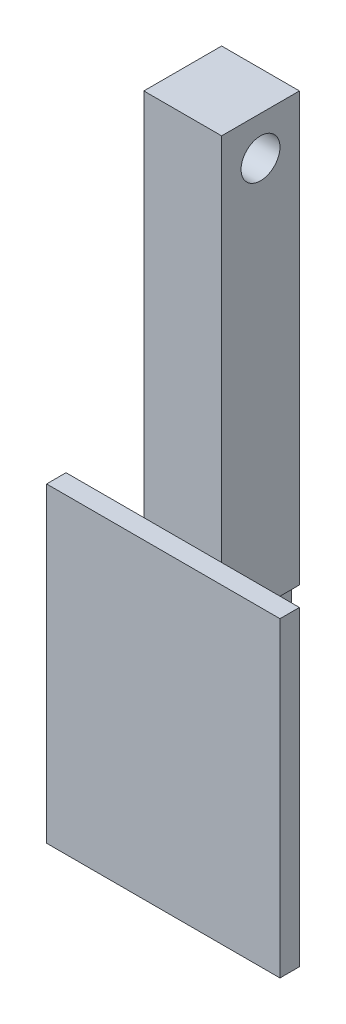
ISO-10303-21;
HEADER;
FILE_DESCRIPTION(('STEP AP214'),'2;1');
FILE_NAME('part.step','',(''),(''),'','','');
FILE_SCHEMA(('AUTOMOTIVE_DESIGN { 1 0 10303 214 1 1 1 1 }'));
ENDSEC;
DATA;
#1=APPLICATION_CONTEXT('core data for automotive mechanical design processes');
#2=APPLICATION_PROTOCOL_DEFINITION('international standard','automotive_design',2000,#1);
#3=PRODUCT_CONTEXT('',#1,'mechanical');
#4=PRODUCT('Part','Part','',(#3));
#5=PRODUCT_RELATED_PRODUCT_CATEGORY('part','',(#4));
#6=PRODUCT_DEFINITION_FORMATION('','',#4);
#7=PRODUCT_DEFINITION_CONTEXT('part definition',#1,'design');
#8=PRODUCT_DEFINITION('design','',#6,#7);
#9=PRODUCT_DEFINITION_SHAPE('','',#8);
#10=(LENGTH_UNIT() NAMED_UNIT(*) SI_UNIT(.MILLI.,.METRE.));
#11=(NAMED_UNIT(*) PLANE_ANGLE_UNIT() SI_UNIT($,.RADIAN.));
#12=(NAMED_UNIT(*) SI_UNIT($,.STERADIAN.) SOLID_ANGLE_UNIT());
#13=UNCERTAINTY_MEASURE_WITH_UNIT(LENGTH_MEASURE(1.E-05),#10,'distance_accuracy_value','');
#14=(GEOMETRIC_REPRESENTATION_CONTEXT(3) GLOBAL_UNCERTAINTY_ASSIGNED_CONTEXT((#13)) GLOBAL_UNIT_ASSIGNED_CONTEXT((#10,
#11,#12)) REPRESENTATION_CONTEXT('',''));
#15=CARTESIAN_POINT('',(0.,0.,0.));
#16=DIRECTION('',(0.,0.,1.));
#17=DIRECTION('',(1.,0.,0.));
#18=AXIS2_PLACEMENT_3D('',#15,#16,#17);
#19=CARTESIAN_POINT('',(-12.7,222.25,12.7));
#20=DIRECTION('',(0.,0.,-1.));
#21=DIRECTION('',(-1.,0.,0.));
#22=AXIS2_PLACEMENT_3D('',#19,#20,#21);
#23=PLANE('',#22);
#24=DIRECTION('',(-1.,0.,0.));
#25=VECTOR('',#24,1.);
#26=CARTESIAN_POINT('',(-38.1,101.6,12.7));
#27=LINE('',#26,#25);
#28=CARTESIAN_POINT('',(12.7,101.6,12.7));
#29=VERTEX_POINT('',#28);
#30=CARTESIAN_POINT('',(-12.7,101.6,12.7));
#31=VERTEX_POINT('',#30);
#32=EDGE_CURVE('E11',#29,#31,#27,.T.);
#33=ORIENTED_EDGE('',*,*,#32,.F.);
#34=DIRECTION('',(0.,-1.,0.));
#35=VECTOR('',#34,1.);
#36=CARTESIAN_POINT('',(12.7,222.25,12.7));
#37=LINE('',#36,#35);
#38=CARTESIAN_POINT('',(12.7,222.25,12.7));
#39=VERTEX_POINT('',#38);
#40=EDGE_CURVE('E223',#39,#29,#37,.T.);
#41=ORIENTED_EDGE('',*,*,#40,.F.);
#42=DIRECTION('',(1.,0.,0.));
#43=VECTOR('',#42,1.);
#44=CARTESIAN_POINT('',(-12.7,222.25,12.7));
#45=LINE('',#44,#43);
#46=CARTESIAN_POINT('',(-12.7,222.25,12.7));
#47=VERTEX_POINT('',#46);
#48=EDGE_CURVE('E218',#47,#39,#45,.T.);
#49=ORIENTED_EDGE('',*,*,#48,.F.);
#50=DIRECTION('',(0.,-1.,0.));
#51=VECTOR('',#50,1.);
#52=CARTESIAN_POINT('',(-12.7,222.25,12.7));
#53=LINE('',#52,#51);
#54=EDGE_CURVE('E226',#47,#31,#53,.T.);
#55=ORIENTED_EDGE('',*,*,#54,.T.);
#56=EDGE_LOOP('',(#33,#41,#49,#55));
#57=FACE_BOUND('',#56,.T.);
#58=ADVANCED_FACE('F39',(#57),#23,.F.);
#59=CARTESIAN_POINT('',(12.7,222.25,-12.7));
#60=DIRECTION('',(-1.,0.,0.));
#61=DIRECTION('',(0.,0.,1.));
#62=AXIS2_PLACEMENT_3D('',#59,#60,#61);
#63=PLANE('',#62);
#64=CARTESIAN_POINT('',(12.7,209.55,0.));
#65=DIRECTION('',(1.,0.,0.));
#66=DIRECTION('',(0.,0.,-1.));
#67=AXIS2_PLACEMENT_3D('',#64,#65,#66);
#68=CIRCLE('',#67,6.35);
#69=CARTESIAN_POINT('',(12.7,209.55,-6.35));
#70=VERTEX_POINT('',#69);
#71=EDGE_CURVE('E164',#70,#70,#68,.T.);
#72=ORIENTED_EDGE('',*,*,#71,.F.);
#73=EDGE_LOOP('',(#72));
#74=FACE_BOUND('',#73,.T.);
#75=ORIENTED_EDGE('',*,*,#40,.T.);
#76=CARTESIAN_POINT('',(12.7,82.55,12.7));
#77=VERTEX_POINT('',#76);
#78=EDGE_CURVE('E220',#29,#77,#37,.T.);
#79=ORIENTED_EDGE('',*,*,#78,.T.);
#80=DIRECTION('',(0.,0.,1.));
#81=VECTOR('',#80,1.);
#82=CARTESIAN_POINT('',(12.7,82.55,-209.55));
#83=LINE('',#82,#81);
#84=CARTESIAN_POINT('',(12.7,82.55,-12.7));
#85=VERTEX_POINT('',#84);
#86=EDGE_CURVE('E192',#85,#77,#83,.T.);
#87=ORIENTED_EDGE('',*,*,#86,.F.);
#88=DIRECTION('',(0.,-1.,0.));
#89=VECTOR('',#88,1.);
#90=CARTESIAN_POINT('',(12.7,222.25,-12.7));
#91=LINE('',#90,#89);
#92=CARTESIAN_POINT('',(12.7,222.25,-12.7));
#93=VERTEX_POINT('',#92);
#94=EDGE_CURVE('E231',#93,#85,#91,.T.);
#95=ORIENTED_EDGE('',*,*,#94,.F.);
#96=DIRECTION('',(0.,0.,-1.));
#97=VECTOR('',#96,1.);
#98=CARTESIAN_POINT('',(12.7,222.25,-12.7));
#99=LINE('',#98,#97);
#100=EDGE_CURVE('E211',#39,#93,#99,.T.);
#101=ORIENTED_EDGE('',*,*,#100,.F.);
#102=EDGE_LOOP('',(#75,#79,#87,#95,#101));
#103=FACE_BOUND('',#102,.T.);
#104=ADVANCED_FACE('F41',(#74,#103),#63,.F.);
#105=CARTESIAN_POINT('',(-12.7,222.25,-12.7));
#106=DIRECTION('',(0.,0.,1.));
#107=DIRECTION('',(1.,0.,0.));
#108=AXIS2_PLACEMENT_3D('',#105,#106,#107);
#109=PLANE('',#108);
#110=DIRECTION('',(0.,1.,0.));
#111=VECTOR('',#110,1.);
#112=CARTESIAN_POINT('',(-10.16,222.25,-12.7));
#113=LINE('',#112,#111);
#114=CARTESIAN_POINT('',(-10.16,0.,-12.7));
#115=VERTEX_POINT('',#114);
#116=CARTESIAN_POINT('',(-10.16,82.55,-12.7));
#117=VERTEX_POINT('',#116);
#118=EDGE_CURVE('E64',#115,#117,#113,.T.);
#119=ORIENTED_EDGE('',*,*,#118,.T.);
#120=DIRECTION('',(-1.,0.,0.));
#121=VECTOR('',#120,1.);
#122=CARTESIAN_POINT('',(-12.7,82.55,-12.7));
#123=LINE('',#122,#121);
#124=CARTESIAN_POINT('',(-12.7,82.55,-12.7));
#125=VERTEX_POINT('',#124);
#126=EDGE_CURVE('E207',#117,#125,#123,.T.);
#127=ORIENTED_EDGE('',*,*,#126,.T.);
#128=DIRECTION('',(0.,-1.,0.));
#129=VECTOR('',#128,1.);
#130=CARTESIAN_POINT('',(-12.7,222.25,-12.7));
#131=LINE('',#130,#129);
#132=CARTESIAN_POINT('',(-12.7,222.25,-12.7));
#133=VERTEX_POINT('',#132);
#134=EDGE_CURVE('E228',#133,#125,#131,.T.);
#135=ORIENTED_EDGE('',*,*,#134,.F.);
#136=DIRECTION('',(-1.,0.,0.));
#137=VECTOR('',#136,1.);
#138=CARTESIAN_POINT('',(-12.7,222.25,-12.7));
#139=LINE('',#138,#137);
#140=EDGE_CURVE('E214',#93,#133,#139,.T.);
#141=ORIENTED_EDGE('',*,*,#140,.F.);
#142=ORIENTED_EDGE('',*,*,#94,.T.);
#143=DIRECTION('',(-1.,0.,0.));
#144=VECTOR('',#143,1.);
#145=CARTESIAN_POINT('',(-12.7,82.55,-12.7));
#146=LINE('',#145,#144);
#147=CARTESIAN_POINT('',(10.16,82.55,-12.7));
#148=VERTEX_POINT('',#147);
#149=EDGE_CURVE('E204',#85,#148,#146,.T.);
#150=ORIENTED_EDGE('',*,*,#149,.T.);
#151=DIRECTION('',(0.,-1.,0.));
#152=VECTOR('',#151,1.);
#153=CARTESIAN_POINT('',(10.16,222.25,-12.7));
#154=LINE('',#153,#152);
#155=CARTESIAN_POINT('',(10.16,0.,-12.7));
#156=VERTEX_POINT('',#155);
#157=EDGE_CURVE('E190',#148,#156,#154,.T.);
#158=ORIENTED_EDGE('',*,*,#157,.T.);
#159=DIRECTION('',(-1.,0.,0.));
#160=VECTOR('',#159,1.);
#161=CARTESIAN_POINT('',(-12.7,0.,-12.7));
#162=LINE('',#161,#160);
#163=EDGE_CURVE('E210',#156,#115,#162,.T.);
#164=ORIENTED_EDGE('',*,*,#163,.T.);
#165=EDGE_LOOP('',(#119,#127,#135,#141,#142,#150,#158,#164));
#166=FACE_BOUND('',#165,.T.);
#167=ADVANCED_FACE('F306',(#166),#109,.F.);
#168=CARTESIAN_POINT('',(-12.7,222.25,-12.7));
#169=DIRECTION('',(1.,0.,0.));
#170=DIRECTION('',(0.,0.,-1.));
#171=AXIS2_PLACEMENT_3D('',#168,#169,#170);
#172=PLANE('',#171);
#173=CARTESIAN_POINT('',(-12.7,209.55,0.));
#174=DIRECTION('',(1.,0.,0.));
#175=DIRECTION('',(0.,0.,-1.));
#176=AXIS2_PLACEMENT_3D('',#173,#174,#175);
#177=CIRCLE('',#176,6.35);
#178=CARTESIAN_POINT('',(-12.7,209.55,-6.35));
#179=VERTEX_POINT('',#178);
#180=EDGE_CURVE('E43',#179,#179,#177,.T.);
#181=ORIENTED_EDGE('',*,*,#180,.T.);
#182=EDGE_LOOP('',(#181));
#183=FACE_BOUND('',#182,.T.);
#184=ORIENTED_EDGE('',*,*,#134,.T.);
#185=DIRECTION('',(0.,0.,1.));
#186=VECTOR('',#185,1.);
#187=CARTESIAN_POINT('',(-12.7,82.55,-209.55));
#188=LINE('',#187,#186);
#189=CARTESIAN_POINT('',(-12.7,82.55,12.7));
#190=VERTEX_POINT('',#189);
#191=EDGE_CURVE('E187',#125,#190,#188,.T.);
#192=ORIENTED_EDGE('',*,*,#191,.T.);
#193=EDGE_CURVE('E225',#31,#190,#53,.T.);
#194=ORIENTED_EDGE('',*,*,#193,.F.);
#195=ORIENTED_EDGE('',*,*,#54,.F.);
#196=DIRECTION('',(0.,0.,1.));
#197=VECTOR('',#196,1.);
#198=CARTESIAN_POINT('',(-12.7,222.25,-12.7));
#199=LINE('',#198,#197);
#200=EDGE_CURVE('E216',#133,#47,#199,.T.);
#201=ORIENTED_EDGE('',*,*,#200,.F.);
#202=EDGE_LOOP('',(#184,#192,#194,#195,#201));
#203=FACE_BOUND('',#202,.T.);
#204=ADVANCED_FACE('F297',(#183,#203),#172,.F.);
#205=CARTESIAN_POINT('',(0.,222.25,0.));
#206=DIRECTION('',(0.,1.,0.));
#207=DIRECTION('',(0.,0.,1.));
#208=AXIS2_PLACEMENT_3D('',#205,#206,#207);
#209=PLANE('',#208);
#210=ORIENTED_EDGE('',*,*,#100,.T.);
#211=ORIENTED_EDGE('',*,*,#140,.T.);
#212=ORIENTED_EDGE('',*,*,#200,.T.);
#213=ORIENTED_EDGE('',*,*,#48,.T.);
#214=EDGE_LOOP('',(#210,#211,#212,#213));
#215=FACE_BOUND('',#214,.T.);
#216=ADVANCED_FACE('F293',(#215),#209,.T.);
#217=CARTESIAN_POINT('',(0.,0.,0.));
#218=DIRECTION('',(0.,1.,0.));
#219=DIRECTION('',(0.,0.,1.));
#220=AXIS2_PLACEMENT_3D('',#217,#218,#219);
#221=PLANE('',#220);
#222=DIRECTION('',(0.,0.,1.));
#223=VECTOR('',#222,1.);
#224=CARTESIAN_POINT('',(10.16,0.,0.));
#225=LINE('',#224,#223);
#226=CARTESIAN_POINT('',(10.16,0.,12.7));
#227=VERTEX_POINT('',#226);
#228=EDGE_CURVE('E234',#156,#227,#225,.T.);
#229=ORIENTED_EDGE('',*,*,#228,.T.);
#230=DIRECTION('',(1.,0.,0.));
#231=VECTOR('',#230,1.);
#232=CARTESIAN_POINT('',(-38.1,0.,12.7));
#233=LINE('',#232,#231);
#234=CARTESIAN_POINT('',(38.1,0.,12.7));
#235=VERTEX_POINT('',#234);
#236=EDGE_CURVE('E270',#227,#235,#233,.T.);
#237=ORIENTED_EDGE('',*,*,#236,.T.);
#238=DIRECTION('',(0.,0.,-1.));
#239=VECTOR('',#238,1.);
#240=CARTESIAN_POINT('',(38.1,0.,19.05));
#241=LINE('',#240,#239);
#242=CARTESIAN_POINT('',(38.1,0.,19.05));
#243=VERTEX_POINT('',#242);
#244=EDGE_CURVE('E147',#243,#235,#241,.T.);
#245=ORIENTED_EDGE('',*,*,#244,.F.);
#246=DIRECTION('',(1.,0.,0.));
#247=VECTOR('',#246,1.);
#248=CARTESIAN_POINT('',(-38.1,0.,19.05));
#249=LINE('',#248,#247);
#250=CARTESIAN_POINT('',(-38.1,0.,19.05));
#251=VERTEX_POINT('',#250);
#252=EDGE_CURVE('E138',#251,#243,#249,.T.);
#253=ORIENTED_EDGE('',*,*,#252,.F.);
#254=DIRECTION('',(0.,0.,-1.));
#255=VECTOR('',#254,1.);
#256=CARTESIAN_POINT('',(-38.1,0.,19.05));
#257=LINE('',#256,#255);
#258=CARTESIAN_POINT('',(-38.1,0.,12.7));
#259=VERTEX_POINT('',#258);
#260=EDGE_CURVE('E144',#251,#259,#257,.T.);
#261=ORIENTED_EDGE('',*,*,#260,.T.);
#262=CARTESIAN_POINT('',(-10.16,0.,12.7));
#263=VERTEX_POINT('',#262);
#264=EDGE_CURVE('E273',#259,#263,#233,.T.);
#265=ORIENTED_EDGE('',*,*,#264,.T.);
#266=DIRECTION('',(0.,0.,-1.));
#267=VECTOR('',#266,1.);
#268=CARTESIAN_POINT('',(-10.16,0.,0.));
#269=LINE('',#268,#267);
#270=EDGE_CURVE('E48',#263,#115,#269,.T.);
#271=ORIENTED_EDGE('',*,*,#270,.T.);
#272=ORIENTED_EDGE('',*,*,#163,.F.);
#273=EDGE_LOOP('',(#229,#237,#245,#253,#261,#265,#271,#272));
#274=FACE_BOUND('',#273,.T.);
#275=ADVANCED_FACE('F141',(#274),#221,.F.);
#276=CARTESIAN_POINT('',(12.7,82.55,-209.55));
#277=DIRECTION('',(0.,1.,0.));
#278=DIRECTION('',(0.,0.,1.));
#279=AXIS2_PLACEMENT_3D('',#276,#277,#278);
#280=PLANE('',#279);
#281=ORIENTED_EDGE('',*,*,#86,.T.);
#282=DIRECTION('',(-1.,0.,0.));
#283=VECTOR('',#282,1.);
#284=CARTESIAN_POINT('',(12.7,82.55,12.7));
#285=LINE('',#284,#283);
#286=CARTESIAN_POINT('',(10.16,82.55,12.7));
#287=VERTEX_POINT('',#286);
#288=EDGE_CURVE('E184',#77,#287,#285,.T.);
#289=ORIENTED_EDGE('',*,*,#288,.T.);
#290=DIRECTION('',(0.,0.,1.));
#291=VECTOR('',#290,1.);
#292=CARTESIAN_POINT('',(10.16,82.55,-209.55));
#293=LINE('',#292,#291);
#294=EDGE_CURVE('E196',#148,#287,#293,.T.);
#295=ORIENTED_EDGE('',*,*,#294,.F.);
#296=ORIENTED_EDGE('',*,*,#149,.F.);
#297=EDGE_LOOP('',(#281,#289,#295,#296));
#298=FACE_BOUND('',#297,.T.);
#299=ADVANCED_FACE('F256',(#298),#280,.F.);
#300=CARTESIAN_POINT('',(10.16,82.55,-209.55));
#301=DIRECTION('',(-1.,0.,0.));
#302=DIRECTION('',(0.,-1.,0.));
#303=AXIS2_PLACEMENT_3D('',#300,#301,#302);
#304=PLANE('',#303);
#305=CARTESIAN_POINT('',(10.16,69.85,-6.34999999999999));
#306=DIRECTION('',(-1.,0.,0.));
#307=DIRECTION('',(0.,-1.,0.));
#308=AXIS2_PLACEMENT_3D('',#305,#306,#307);
#309=CIRCLE('',#308,3.175);
#310=CARTESIAN_POINT('',(10.16,66.675,-6.34999999999999));
#311=VERTEX_POINT('',#310);
#312=EDGE_CURVE('E177',#311,#311,#309,.T.);
#313=ORIENTED_EDGE('',*,*,#312,.T.);
#314=EDGE_LOOP('',(#313));
#315=FACE_BOUND('',#314,.T.);
#316=CARTESIAN_POINT('',(10.16,29.21,-6.34999999999999));
#317=DIRECTION('',(-1.,0.,0.));
#318=DIRECTION('',(0.,-1.,0.));
#319=AXIS2_PLACEMENT_3D('',#316,#317,#318);
#320=CIRCLE('',#319,3.175);
#321=CARTESIAN_POINT('',(10.16,26.035,-6.34999999999999));
#322=VERTEX_POINT('',#321);
#323=EDGE_CURVE('E173',#322,#322,#320,.T.);
#324=ORIENTED_EDGE('',*,*,#323,.T.);
#325=EDGE_LOOP('',(#324));
#326=FACE_BOUND('',#325,.T.);
#327=ORIENTED_EDGE('',*,*,#294,.T.);
#328=DIRECTION('',(0.,-1.,0.));
#329=VECTOR('',#328,1.);
#330=CARTESIAN_POINT('',(10.16,82.55,12.7));
#331=LINE('',#330,#329);
#332=EDGE_CURVE('E195',#287,#227,#331,.T.);
#333=ORIENTED_EDGE('',*,*,#332,.T.);
#334=ORIENTED_EDGE('',*,*,#228,.F.);
#335=ORIENTED_EDGE('',*,*,#157,.F.);
#336=EDGE_LOOP('',(#327,#333,#334,#335));
#337=FACE_BOUND('',#336,.T.);
#338=ADVANCED_FACE('F252',(#315,#326,#337),#304,.F.);
#339=CARTESIAN_POINT('',(-12.7,82.55,-209.55));
#340=DIRECTION('',(0.,1.,0.));
#341=DIRECTION('',(0.,0.,1.));
#342=AXIS2_PLACEMENT_3D('',#339,#340,#341);
#343=PLANE('',#342);
#344=DIRECTION('',(0.,0.,1.));
#345=VECTOR('',#344,1.);
#346=CARTESIAN_POINT('',(-10.16,82.55,-209.55));
#347=LINE('',#346,#345);
#348=CARTESIAN_POINT('',(-10.16,82.55,12.7));
#349=VERTEX_POINT('',#348);
#350=EDGE_CURVE('E186',#117,#349,#347,.T.);
#351=ORIENTED_EDGE('',*,*,#350,.T.);
#352=DIRECTION('',(-1.,0.,0.));
#353=VECTOR('',#352,1.);
#354=CARTESIAN_POINT('',(-12.7,82.55,12.7));
#355=LINE('',#354,#353);
#356=EDGE_CURVE('E183',#349,#190,#355,.T.);
#357=ORIENTED_EDGE('',*,*,#356,.T.);
#358=ORIENTED_EDGE('',*,*,#191,.F.);
#359=ORIENTED_EDGE('',*,*,#126,.F.);
#360=EDGE_LOOP('',(#351,#357,#358,#359));
#361=FACE_BOUND('',#360,.T.);
#362=ADVANCED_FACE('F255',(#361),#343,.F.);
#363=CARTESIAN_POINT('',(-10.16,82.55,-209.55));
#364=DIRECTION('',(1.,0.,0.));
#365=DIRECTION('',(0.,1.,0.));
#366=AXIS2_PLACEMENT_3D('',#363,#364,#365);
#367=PLANE('',#366);
#368=CARTESIAN_POINT('',(-10.16,69.85,-6.34999999999999));
#369=DIRECTION('',(1.,0.,0.));
#370=DIRECTION('',(0.,1.,0.));
#371=AXIS2_PLACEMENT_3D('',#368,#369,#370);
#372=CIRCLE('',#371,3.175);
#373=CARTESIAN_POINT('',(-10.16,73.025,-6.34999999999999));
#374=VERTEX_POINT('',#373);
#375=EDGE_CURVE('E176',#374,#374,#372,.T.);
#376=ORIENTED_EDGE('',*,*,#375,.T.);
#377=EDGE_LOOP('',(#376));
#378=FACE_BOUND('',#377,.T.);
#379=CARTESIAN_POINT('',(-10.16,29.21,-6.34999999999999));
#380=DIRECTION('',(1.,0.,0.));
#381=DIRECTION('',(0.,1.,0.));
#382=AXIS2_PLACEMENT_3D('',#379,#380,#381);
#383=CIRCLE('',#382,3.175);
#384=CARTESIAN_POINT('',(-10.16,32.385,-6.34999999999999));
#385=VERTEX_POINT('',#384);
#386=EDGE_CURVE('E167',#385,#385,#383,.T.);
#387=ORIENTED_EDGE('',*,*,#386,.T.);
#388=EDGE_LOOP('',(#387));
#389=FACE_BOUND('',#388,.T.);
#390=ORIENTED_EDGE('',*,*,#270,.F.);
#391=DIRECTION('',(0.,1.,0.));
#392=VECTOR('',#391,1.);
#393=CARTESIAN_POINT('',(-10.16,82.55,12.7));
#394=LINE('',#393,#392);
#395=EDGE_CURVE('E180',#263,#349,#394,.T.);
#396=ORIENTED_EDGE('',*,*,#395,.T.);
#397=ORIENTED_EDGE('',*,*,#350,.F.);
#398=ORIENTED_EDGE('',*,*,#118,.F.);
#399=EDGE_LOOP('',(#390,#396,#397,#398));
#400=FACE_BOUND('',#399,.T.);
#401=ADVANCED_FACE('F241',(#378,#389,#400),#367,.F.);
#402=CARTESIAN_POINT('',(-209.55,29.21,-6.34999999999996));
#403=DIRECTION('',(1.,0.,0.));
#404=DIRECTION('',(0.,0.,-1.));
#405=AXIS2_PLACEMENT_3D('',#402,#403,#404);
#406=CYLINDRICAL_SURFACE('',#405,3.175);
#407=ORIENTED_EDGE('',*,*,#386,.F.);
#408=EDGE_LOOP('',(#407));
#409=FACE_BOUND('',#408,.T.);
#410=ORIENTED_EDGE('',*,*,#323,.F.);
#411=EDGE_LOOP('',(#410));
#412=FACE_BOUND('',#411,.T.);
#413=ADVANCED_FACE('F248',(#409,#412),#406,.F.);
#414=CARTESIAN_POINT('',(-209.55,69.85,-6.34999999999996));
#415=DIRECTION('',(1.,0.,0.));
#416=DIRECTION('',(0.,0.,-1.));
#417=AXIS2_PLACEMENT_3D('',#414,#415,#416);
#418=CYLINDRICAL_SURFACE('',#417,3.175);
#419=ORIENTED_EDGE('',*,*,#375,.F.);
#420=EDGE_LOOP('',(#419));
#421=FACE_BOUND('',#420,.T.);
#422=ORIENTED_EDGE('',*,*,#312,.F.);
#423=EDGE_LOOP('',(#422));
#424=FACE_BOUND('',#423,.T.);
#425=ADVANCED_FACE('F244',(#421,#424),#418,.F.);
#426=CARTESIAN_POINT('',(-209.55,209.55,0.));
#427=DIRECTION('',(1.,0.,0.));
#428=DIRECTION('',(0.,0.,-1.));
#429=AXIS2_PLACEMENT_3D('',#426,#427,#428);
#430=CYLINDRICAL_SURFACE('',#429,6.35);
#431=ORIENTED_EDGE('',*,*,#71,.T.);
#432=EDGE_LOOP('',(#431));
#433=FACE_BOUND('',#432,.T.);
#434=ORIENTED_EDGE('',*,*,#180,.F.);
#435=EDGE_LOOP('',(#434));
#436=FACE_BOUND('',#435,.T.);
#437=ADVANCED_FACE('F247',(#433,#436),#430,.F.);
#438=CARTESIAN_POINT('',(0.,0.,12.7));
#439=DIRECTION('',(0.,0.,1.));
#440=DIRECTION('',(1.,0.,0.));
#441=AXIS2_PLACEMENT_3D('',#438,#439,#440);
#442=PLANE('',#441);
#443=CARTESIAN_POINT('',(-38.1,101.6,12.7));
#444=VERTEX_POINT('',#443);
#445=EDGE_CURVE('E51',#31,#444,#27,.T.);
#446=ORIENTED_EDGE('',*,*,#445,.F.);
#447=ORIENTED_EDGE('',*,*,#193,.T.);
#448=ORIENTED_EDGE('',*,*,#356,.F.);
#449=ORIENTED_EDGE('',*,*,#395,.F.);
#450=ORIENTED_EDGE('',*,*,#264,.F.);
#451=DIRECTION('',(0.,-1.,0.));
#452=VECTOR('',#451,1.);
#453=CARTESIAN_POINT('',(-38.1,101.6,12.7));
#454=LINE('',#453,#452);
#455=EDGE_CURVE('E163',#444,#259,#454,.T.);
#456=ORIENTED_EDGE('',*,*,#455,.F.);
#457=EDGE_LOOP('',(#446,#447,#448,#449,#450,#456));
#458=FACE_BOUND('',#457,.T.);
#459=ADVANCED_FACE('F302',(#458),#442,.F.);
#460=CARTESIAN_POINT('',(-38.1,101.6,19.05));
#461=DIRECTION('',(1.,0.,0.));
#462=DIRECTION('',(0.,1.,0.));
#463=AXIS2_PLACEMENT_3D('',#460,#461,#462);
#464=PLANE('',#463);
#465=ORIENTED_EDGE('',*,*,#455,.T.);
#466=ORIENTED_EDGE('',*,*,#260,.F.);
#467=DIRECTION('',(0.,-1.,0.));
#468=VECTOR('',#467,1.);
#469=CARTESIAN_POINT('',(-38.1,101.6,19.05));
#470=LINE('',#469,#468);
#471=CARTESIAN_POINT('',(-38.1,101.6,19.05));
#472=VERTEX_POINT('',#471);
#473=EDGE_CURVE('E151',#472,#251,#470,.T.);
#474=ORIENTED_EDGE('',*,*,#473,.F.);
#475=DIRECTION('',(0.,0.,-1.));
#476=VECTOR('',#475,1.);
#477=CARTESIAN_POINT('',(-38.1,101.6,19.05));
#478=LINE('',#477,#476);
#479=EDGE_CURVE('E280',#472,#444,#478,.T.);
#480=ORIENTED_EDGE('',*,*,#479,.T.);
#481=EDGE_LOOP('',(#465,#466,#474,#480));
#482=FACE_BOUND('',#481,.T.);
#483=ADVANCED_FACE('F161',(#482),#464,.F.);
#484=CARTESIAN_POINT('',(38.1,0.,19.05));
#485=DIRECTION('',(-1.,0.,0.));
#486=DIRECTION('',(0.,-1.,0.));
#487=AXIS2_PLACEMENT_3D('',#484,#485,#486);
#488=PLANE('',#487);
#489=DIRECTION('',(0.,1.,0.));
#490=VECTOR('',#489,1.);
#491=CARTESIAN_POINT('',(38.1,0.,12.7));
#492=LINE('',#491,#490);
#493=CARTESIAN_POINT('',(38.1,101.6,12.7));
#494=VERTEX_POINT('',#493);
#495=EDGE_CURVE('E272',#235,#494,#492,.T.);
#496=ORIENTED_EDGE('',*,*,#495,.T.);
#497=DIRECTION('',(0.,0.,-1.));
#498=VECTOR('',#497,1.);
#499=CARTESIAN_POINT('',(38.1,101.6,19.05));
#500=LINE('',#499,#498);
#501=CARTESIAN_POINT('',(38.1,101.6,19.05));
#502=VERTEX_POINT('',#501);
#503=EDGE_CURVE('E169',#502,#494,#500,.T.);
#504=ORIENTED_EDGE('',*,*,#503,.F.);
#505=DIRECTION('',(0.,1.,0.));
#506=VECTOR('',#505,1.);
#507=CARTESIAN_POINT('',(38.1,0.,19.05));
#508=LINE('',#507,#506);
#509=EDGE_CURVE('E150',#243,#502,#508,.T.);
#510=ORIENTED_EDGE('',*,*,#509,.F.);
#511=ORIENTED_EDGE('',*,*,#244,.T.);
#512=EDGE_LOOP('',(#496,#504,#510,#511));
#513=FACE_BOUND('',#512,.T.);
#514=ADVANCED_FACE('F388',(#513),#488,.F.);
#515=CARTESIAN_POINT('',(-38.1,101.6,19.05));
#516=DIRECTION('',(0.,-1.,0.));
#517=DIRECTION('',(0.,0.,-1.));
#518=AXIS2_PLACEMENT_3D('',#515,#516,#517);
#519=PLANE('',#518);
#520=EDGE_CURVE('E50',#494,#29,#27,.T.);
#521=ORIENTED_EDGE('',*,*,#520,.T.);
#522=ORIENTED_EDGE('',*,*,#32,.T.);
#523=ORIENTED_EDGE('',*,*,#445,.T.);
#524=ORIENTED_EDGE('',*,*,#479,.F.);
#525=DIRECTION('',(-1.,0.,0.));
#526=VECTOR('',#525,1.);
#527=CARTESIAN_POINT('',(-38.1,101.6,19.05));
#528=LINE('',#527,#526);
#529=EDGE_CURVE('E156',#502,#472,#528,.T.);
#530=ORIENTED_EDGE('',*,*,#529,.F.);
#531=ORIENTED_EDGE('',*,*,#503,.T.);
#532=EDGE_LOOP('',(#521,#522,#523,#524,#530,#531));
#533=FACE_BOUND('',#532,.T.);
#534=ADVANCED_FACE('F284',(#533),#519,.F.);
#535=CARTESIAN_POINT('',(0.,0.,19.05));
#536=DIRECTION('',(0.,0.,1.));
#537=DIRECTION('',(1.,0.,0.));
#538=AXIS2_PLACEMENT_3D('',#535,#536,#537);
#539=PLANE('',#538);
#540=ORIENTED_EDGE('',*,*,#473,.T.);
#541=ORIENTED_EDGE('',*,*,#252,.T.);
#542=ORIENTED_EDGE('',*,*,#509,.T.);
#543=ORIENTED_EDGE('',*,*,#529,.T.);
#544=EDGE_LOOP('',(#540,#541,#542,#543));
#545=FACE_BOUND('',#544,.T.);
#546=ADVANCED_FACE('F154',(#545),#539,.T.);
#547=ORIENTED_EDGE('',*,*,#332,.F.);
#548=ORIENTED_EDGE('',*,*,#288,.F.);
#549=ORIENTED_EDGE('',*,*,#78,.F.);
#550=ORIENTED_EDGE('',*,*,#520,.F.);
#551=ORIENTED_EDGE('',*,*,#495,.F.);
#552=ORIENTED_EDGE('',*,*,#236,.F.);
#553=EDGE_LOOP('',(#547,#548,#549,#550,#551,#552));
#554=FACE_BOUND('',#553,.T.);
#555=ADVANCED_FACE('F268',(#554),#442,.F.);
#556=CLOSED_SHELL('',(#58,#104,#167,#204,#216,#275,#299,#338,#362,#401,#413,#425,#437,#459,#483,
#514,#534,#546,#555));
#557=MANIFOLD_SOLID_BREP('B2',#556);
#558=ADVANCED_BREP_SHAPE_REPRESENTATION('',(#18,#557),#14);
#559=SHAPE_DEFINITION_REPRESENTATION(#9,#558);
ENDSEC;
END-ISO-10303-21;
